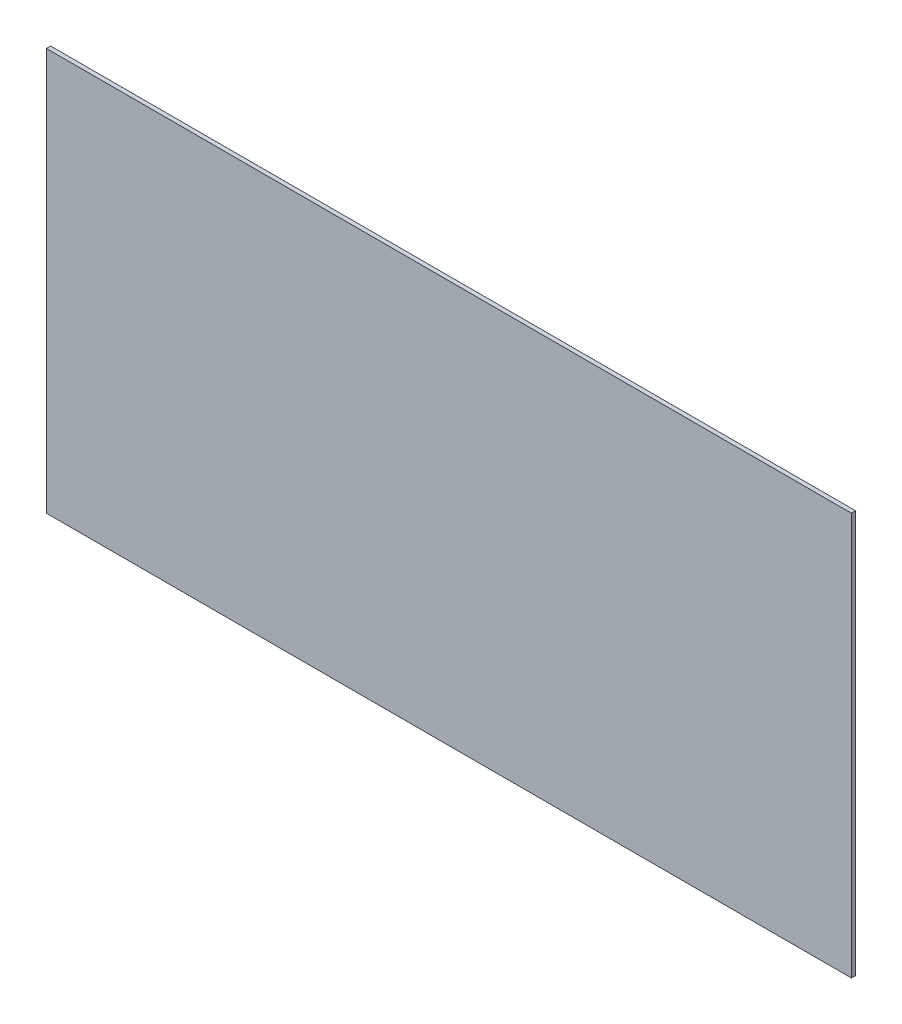
ISO-10303-21;
HEADER;
FILE_DESCRIPTION(('STEP AP214'),'2;1');
FILE_NAME('part.step','',(''),(''),'','','');
FILE_SCHEMA(('AUTOMOTIVE_DESIGN { 1 0 10303 214 1 1 1 1 }'));
ENDSEC;
DATA;
#1=APPLICATION_CONTEXT('core data for automotive mechanical design processes');
#2=APPLICATION_PROTOCOL_DEFINITION('international standard','automotive_design',2000,#1);
#3=PRODUCT_CONTEXT('',#1,'mechanical');
#4=PRODUCT('Part','Part','',(#3));
#5=PRODUCT_RELATED_PRODUCT_CATEGORY('part','',(#4));
#6=PRODUCT_DEFINITION_FORMATION('','',#4);
#7=PRODUCT_DEFINITION_CONTEXT('part definition',#1,'design');
#8=PRODUCT_DEFINITION('design','',#6,#7);
#9=PRODUCT_DEFINITION_SHAPE('','',#8);
#10=(LENGTH_UNIT() NAMED_UNIT(*) SI_UNIT(.MILLI.,.METRE.));
#11=(NAMED_UNIT(*) PLANE_ANGLE_UNIT() SI_UNIT($,.RADIAN.));
#12=(NAMED_UNIT(*) SI_UNIT($,.STERADIAN.) SOLID_ANGLE_UNIT());
#13=UNCERTAINTY_MEASURE_WITH_UNIT(LENGTH_MEASURE(1.E-05),#10,'distance_accuracy_value','');
#14=(GEOMETRIC_REPRESENTATION_CONTEXT(3) GLOBAL_UNCERTAINTY_ASSIGNED_CONTEXT((#13)) GLOBAL_UNIT_ASSIGNED_CONTEXT((#10,
#11,#12)) REPRESENTATION_CONTEXT('',''));
#15=CARTESIAN_POINT('',(0.,0.,0.));
#16=DIRECTION('',(0.,0.,1.));
#17=DIRECTION('',(1.,0.,0.));
#18=AXIS2_PLACEMENT_3D('',#15,#16,#17);
#19=CARTESIAN_POINT('',(0.,0.,6.35));
#20=DIRECTION('',(1.,0.,0.));
#21=DIRECTION('',(0.,0.,-1.));
#22=AXIS2_PLACEMENT_3D('',#19,#20,#21);
#23=PLANE('',#22);
#24=DIRECTION('',(0.,-1.,0.));
#25=VECTOR('',#24,1.);
#26=CARTESIAN_POINT('',(0.,0.,0.));
#27=LINE('',#26,#25);
#28=CARTESIAN_POINT('',(0.,609.6,0.));
#29=VERTEX_POINT('',#28);
#30=CARTESIAN_POINT('',(0.,0.,0.));
#31=VERTEX_POINT('',#30);
#32=EDGE_CURVE('E99',#29,#31,#27,.T.);
#33=ORIENTED_EDGE('',*,*,#32,.T.);
#34=DIRECTION('',(0.,0.,-1.));
#35=VECTOR('',#34,1.);
#36=CARTESIAN_POINT('',(0.,0.,6.35));
#37=LINE('',#36,#35);
#38=CARTESIAN_POINT('',(0.,0.,6.35));
#39=VERTEX_POINT('',#38);
#40=EDGE_CURVE('E11',#39,#31,#37,.T.);
#41=ORIENTED_EDGE('',*,*,#40,.F.);
#42=DIRECTION('',(0.,-1.,0.));
#43=VECTOR('',#42,1.);
#44=CARTESIAN_POINT('',(0.,0.,6.35));
#45=LINE('',#44,#43);
#46=CARTESIAN_POINT('',(0.,609.6,6.35));
#47=VERTEX_POINT('',#46);
#48=EDGE_CURVE('E87',#47,#39,#45,.T.);
#49=ORIENTED_EDGE('',*,*,#48,.F.);
#50=DIRECTION('',(0.,0.,-1.));
#51=VECTOR('',#50,1.);
#52=CARTESIAN_POINT('',(0.,609.6,6.35));
#53=LINE('',#52,#51);
#54=EDGE_CURVE('E95',#47,#29,#53,.T.);
#55=ORIENTED_EDGE('',*,*,#54,.T.);
#56=EDGE_LOOP('',(#33,#41,#49,#55));
#57=FACE_BOUND('',#56,.T.);
#58=ADVANCED_FACE('F36',(#57),#23,.F.);
#59=CARTESIAN_POINT('',(0.,0.,6.35));
#60=DIRECTION('',(0.,1.,0.));
#61=DIRECTION('',(0.,0.,1.));
#62=AXIS2_PLACEMENT_3D('',#59,#60,#61);
#63=PLANE('',#62);
#64=DIRECTION('',(1.,0.,0.));
#65=VECTOR('',#64,1.);
#66=CARTESIAN_POINT('',(0.,0.,0.));
#67=LINE('',#66,#65);
#68=CARTESIAN_POINT('',(1219.2,0.,0.));
#69=VERTEX_POINT('',#68);
#70=EDGE_CURVE('E91',#31,#69,#67,.T.);
#71=ORIENTED_EDGE('',*,*,#70,.T.);
#72=DIRECTION('',(0.,0.,-1.));
#73=VECTOR('',#72,1.);
#74=CARTESIAN_POINT('',(1219.2,0.,6.35));
#75=LINE('',#74,#73);
#76=CARTESIAN_POINT('',(1219.2,0.,6.35));
#77=VERTEX_POINT('',#76);
#78=EDGE_CURVE('E44',#77,#69,#75,.T.);
#79=ORIENTED_EDGE('',*,*,#78,.F.);
#80=DIRECTION('',(1.,0.,0.));
#81=VECTOR('',#80,1.);
#82=CARTESIAN_POINT('',(0.,0.,6.35));
#83=LINE('',#82,#81);
#84=EDGE_CURVE('E82',#39,#77,#83,.T.);
#85=ORIENTED_EDGE('',*,*,#84,.F.);
#86=ORIENTED_EDGE('',*,*,#40,.T.);
#87=EDGE_LOOP('',(#71,#79,#85,#86));
#88=FACE_BOUND('',#87,.T.);
#89=ADVANCED_FACE('F90',(#88),#63,.F.);
#90=CARTESIAN_POINT('',(1219.2,0.,6.35));
#91=DIRECTION('',(-1.,0.,0.));
#92=DIRECTION('',(0.,0.,1.));
#93=AXIS2_PLACEMENT_3D('',#90,#91,#92);
#94=PLANE('',#93);
#95=DIRECTION('',(0.,1.,0.));
#96=VECTOR('',#95,1.);
#97=CARTESIAN_POINT('',(1219.2,0.,0.));
#98=LINE('',#97,#96);
#99=CARTESIAN_POINT('',(1219.2,609.6,0.));
#100=VERTEX_POINT('',#99);
#101=EDGE_CURVE('E69',#69,#100,#98,.T.);
#102=ORIENTED_EDGE('',*,*,#101,.T.);
#103=DIRECTION('',(0.,0.,-1.));
#104=VECTOR('',#103,1.);
#105=CARTESIAN_POINT('',(1219.2,609.6,6.35));
#106=LINE('',#105,#104);
#107=CARTESIAN_POINT('',(1219.2,609.6,6.35));
#108=VERTEX_POINT('',#107);
#109=EDGE_CURVE('E92',#108,#100,#106,.T.);
#110=ORIENTED_EDGE('',*,*,#109,.F.);
#111=DIRECTION('',(0.,1.,0.));
#112=VECTOR('',#111,1.);
#113=CARTESIAN_POINT('',(1219.2,0.,6.35));
#114=LINE('',#113,#112);
#115=EDGE_CURVE('E85',#77,#108,#114,.T.);
#116=ORIENTED_EDGE('',*,*,#115,.F.);
#117=ORIENTED_EDGE('',*,*,#78,.T.);
#118=EDGE_LOOP('',(#102,#110,#116,#117));
#119=FACE_BOUND('',#118,.T.);
#120=ADVANCED_FACE('F93',(#119),#94,.F.);
#121=CARTESIAN_POINT('',(0.,609.6,6.35));
#122=DIRECTION('',(0.,-1.,0.));
#123=DIRECTION('',(0.,0.,-1.));
#124=AXIS2_PLACEMENT_3D('',#121,#122,#123);
#125=PLANE('',#124);
#126=DIRECTION('',(-1.,0.,0.));
#127=VECTOR('',#126,1.);
#128=CARTESIAN_POINT('',(0.,609.6,0.));
#129=LINE('',#128,#127);
#130=EDGE_CURVE('E75',#100,#29,#129,.T.);
#131=ORIENTED_EDGE('',*,*,#130,.T.);
#132=ORIENTED_EDGE('',*,*,#54,.F.);
#133=DIRECTION('',(-1.,0.,0.));
#134=VECTOR('',#133,1.);
#135=CARTESIAN_POINT('',(0.,609.6,6.35));
#136=LINE('',#135,#134);
#137=EDGE_CURVE('E52',#108,#47,#136,.T.);
#138=ORIENTED_EDGE('',*,*,#137,.F.);
#139=ORIENTED_EDGE('',*,*,#109,.T.);
#140=EDGE_LOOP('',(#131,#132,#138,#139));
#141=FACE_BOUND('',#140,.T.);
#142=ADVANCED_FACE('F106',(#141),#125,.F.);
#143=CARTESIAN_POINT('',(0.,0.,6.35));
#144=DIRECTION('',(0.,0.,-1.));
#145=DIRECTION('',(-1.,0.,0.));
#146=AXIS2_PLACEMENT_3D('',#143,#144,#145);
#147=PLANE('',#146);
#148=ORIENTED_EDGE('',*,*,#48,.T.);
#149=ORIENTED_EDGE('',*,*,#84,.T.);
#150=ORIENTED_EDGE('',*,*,#115,.T.);
#151=ORIENTED_EDGE('',*,*,#137,.T.);
#152=EDGE_LOOP('',(#148,#149,#150,#151));
#153=FACE_BOUND('',#152,.T.);
#154=ADVANCED_FACE('F83',(#153),#147,.F.);
#155=CARTESIAN_POINT('',(0.,0.,0.));
#156=DIRECTION('',(0.,0.,-1.));
#157=DIRECTION('',(-1.,0.,0.));
#158=AXIS2_PLACEMENT_3D('',#155,#156,#157);
#159=PLANE('',#158);
#160=ORIENTED_EDGE('',*,*,#32,.F.);
#161=ORIENTED_EDGE('',*,*,#130,.F.);
#162=ORIENTED_EDGE('',*,*,#101,.F.);
#163=ORIENTED_EDGE('',*,*,#70,.F.);
#164=EDGE_LOOP('',(#160,#161,#162,#163));
#165=FACE_BOUND('',#164,.T.);
#166=ADVANCED_FACE('F109',(#165),#159,.T.);
#167=CLOSED_SHELL('',(#58,#89,#120,#142,#154,#166));
#168=MANIFOLD_SOLID_BREP('B2',#167);
#169=ADVANCED_BREP_SHAPE_REPRESENTATION('',(#18,#168),#14);
#170=SHAPE_DEFINITION_REPRESENTATION(#9,#169);
ENDSEC;
END-ISO-10303-21;
